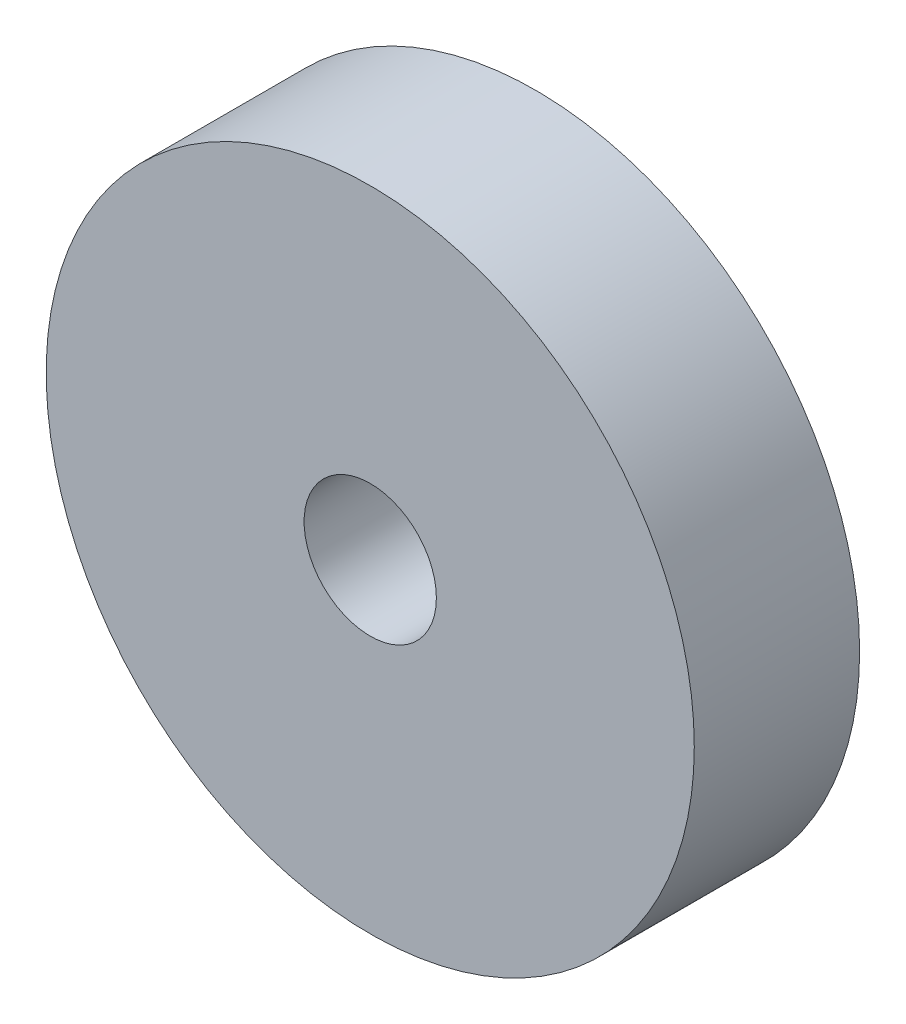
ISO-10303-21;
HEADER;
FILE_DESCRIPTION(('STEP AP214'),'2;1');
FILE_NAME('part.step','',(''),(''),'','','');
FILE_SCHEMA(('AUTOMOTIVE_DESIGN { 1 0 10303 214 1 1 1 1 }'));
ENDSEC;
DATA;
#1=APPLICATION_CONTEXT('core data for automotive mechanical design processes');
#2=APPLICATION_PROTOCOL_DEFINITION('international standard','automotive_design',2000,#1);
#3=PRODUCT_CONTEXT('',#1,'mechanical');
#4=PRODUCT('Part','Part','',(#3));
#5=PRODUCT_RELATED_PRODUCT_CATEGORY('part','',(#4));
#6=PRODUCT_DEFINITION_FORMATION('','',#4);
#7=PRODUCT_DEFINITION_CONTEXT('part definition',#1,'design');
#8=PRODUCT_DEFINITION('design','',#6,#7);
#9=PRODUCT_DEFINITION_SHAPE('','',#8);
#10=(LENGTH_UNIT() NAMED_UNIT(*) SI_UNIT(.MILLI.,.METRE.));
#11=(NAMED_UNIT(*) PLANE_ANGLE_UNIT() SI_UNIT($,.RADIAN.));
#12=(NAMED_UNIT(*) SI_UNIT($,.STERADIAN.) SOLID_ANGLE_UNIT());
#13=UNCERTAINTY_MEASURE_WITH_UNIT(LENGTH_MEASURE(1.E-05),#10,'distance_accuracy_value','');
#14=(GEOMETRIC_REPRESENTATION_CONTEXT(3) GLOBAL_UNCERTAINTY_ASSIGNED_CONTEXT((#13)) GLOBAL_UNIT_ASSIGNED_CONTEXT((#10,
#11,#12)) REPRESENTATION_CONTEXT('',''));
#15=CARTESIAN_POINT('',(0.,0.,0.));
#16=DIRECTION('',(0.,0.,1.));
#17=DIRECTION('',(1.,0.,0.));
#18=AXIS2_PLACEMENT_3D('',#15,#16,#17);
#19=CARTESIAN_POINT('',(0.,0.,50.));
#20=DIRECTION('',(0.,0.,1.));
#21=DIRECTION('',(1.,0.,0.));
#22=AXIS2_PLACEMENT_3D('',#19,#20,#21);
#23=PLANE('',#22);
#24=CARTESIAN_POINT('',(0.,0.,50.));
#25=DIRECTION('',(0.,0.,1.));
#26=DIRECTION('',(1.,0.,0.));
#27=AXIS2_PLACEMENT_3D('',#24,#25,#26);
#28=CIRCLE('',#27,98.);
#29=CARTESIAN_POINT('',(98.,0.,50.));
#30=VERTEX_POINT('',#29);
#31=EDGE_CURVE('E10',#30,#30,#28,.T.);
#32=ORIENTED_EDGE('',*,*,#31,.T.);
#33=EDGE_LOOP('',(#32));
#34=FACE_BOUND('',#33,.T.);
#35=CARTESIAN_POINT('',(0.,0.,50.));
#36=DIRECTION('',(0.,0.,1.));
#37=DIRECTION('',(1.,0.,0.));
#38=AXIS2_PLACEMENT_3D('',#35,#36,#37);
#39=CIRCLE('',#38,20.);
#40=CARTESIAN_POINT('',(20.,0.,50.));
#41=VERTEX_POINT('',#40);
#42=EDGE_CURVE('E39',#41,#41,#39,.T.);
#43=ORIENTED_EDGE('',*,*,#42,.F.);
#44=EDGE_LOOP('',(#43));
#45=FACE_BOUND('',#44,.T.);
#46=ADVANCED_FACE('F28',(#34,#45),#23,.T.);
#47=CARTESIAN_POINT('',(0.,0.,0.));
#48=DIRECTION('',(0.,0.,1.));
#49=DIRECTION('',(1.,0.,0.));
#50=AXIS2_PLACEMENT_3D('',#47,#48,#49);
#51=PLANE('',#50);
#52=CARTESIAN_POINT('',(0.,0.,0.));
#53=DIRECTION('',(0.,0.,1.));
#54=DIRECTION('',(1.,0.,0.));
#55=AXIS2_PLACEMENT_3D('',#52,#53,#54);
#56=CIRCLE('',#55,98.);
#57=CARTESIAN_POINT('',(98.,0.,0.));
#58=VERTEX_POINT('',#57);
#59=EDGE_CURVE('E32',#58,#58,#56,.T.);
#60=ORIENTED_EDGE('',*,*,#59,.F.);
#61=EDGE_LOOP('',(#60));
#62=FACE_BOUND('',#61,.T.);
#63=CARTESIAN_POINT('',(0.,0.,0.));
#64=DIRECTION('',(0.,0.,1.));
#65=DIRECTION('',(1.,0.,0.));
#66=AXIS2_PLACEMENT_3D('',#63,#64,#65);
#67=CIRCLE('',#66,20.);
#68=CARTESIAN_POINT('',(20.,0.,0.));
#69=VERTEX_POINT('',#68);
#70=EDGE_CURVE('E41',#69,#69,#67,.T.);
#71=ORIENTED_EDGE('',*,*,#70,.T.);
#72=EDGE_LOOP('',(#71));
#73=FACE_BOUND('',#72,.T.);
#74=ADVANCED_FACE('F51',(#62,#73),#51,.F.);
#75=CARTESIAN_POINT('',(0.,0.,50.));
#76=DIRECTION('',(0.,0.,-1.));
#77=DIRECTION('',(-1.,0.,0.));
#78=AXIS2_PLACEMENT_3D('',#75,#76,#77);
#79=CYLINDRICAL_SURFACE('',#78,98.);
#80=ORIENTED_EDGE('',*,*,#31,.F.);
#81=EDGE_LOOP('',(#80));
#82=FACE_BOUND('',#81,.T.);
#83=ORIENTED_EDGE('',*,*,#59,.T.);
#84=EDGE_LOOP('',(#83));
#85=FACE_BOUND('',#84,.T.);
#86=ADVANCED_FACE('F30',(#82,#85),#79,.T.);
#87=CARTESIAN_POINT('',(0.,0.,50.));
#88=DIRECTION('',(0.,0.,-1.));
#89=DIRECTION('',(-1.,0.,0.));
#90=AXIS2_PLACEMENT_3D('',#87,#88,#89);
#91=CYLINDRICAL_SURFACE('',#90,20.);
#92=ORIENTED_EDGE('',*,*,#42,.T.);
#93=EDGE_LOOP('',(#92));
#94=FACE_BOUND('',#93,.T.);
#95=ORIENTED_EDGE('',*,*,#70,.F.);
#96=EDGE_LOOP('',(#95));
#97=FACE_BOUND('',#96,.T.);
#98=ADVANCED_FACE('F47',(#94,#97),#91,.F.);
#99=CLOSED_SHELL('',(#46,#74,#86,#98));
#100=MANIFOLD_SOLID_BREP('B2',#99);
#101=ADVANCED_BREP_SHAPE_REPRESENTATION('',(#18,#100),#14);
#102=SHAPE_DEFINITION_REPRESENTATION(#9,#101);
ENDSEC;
END-ISO-10303-21;
